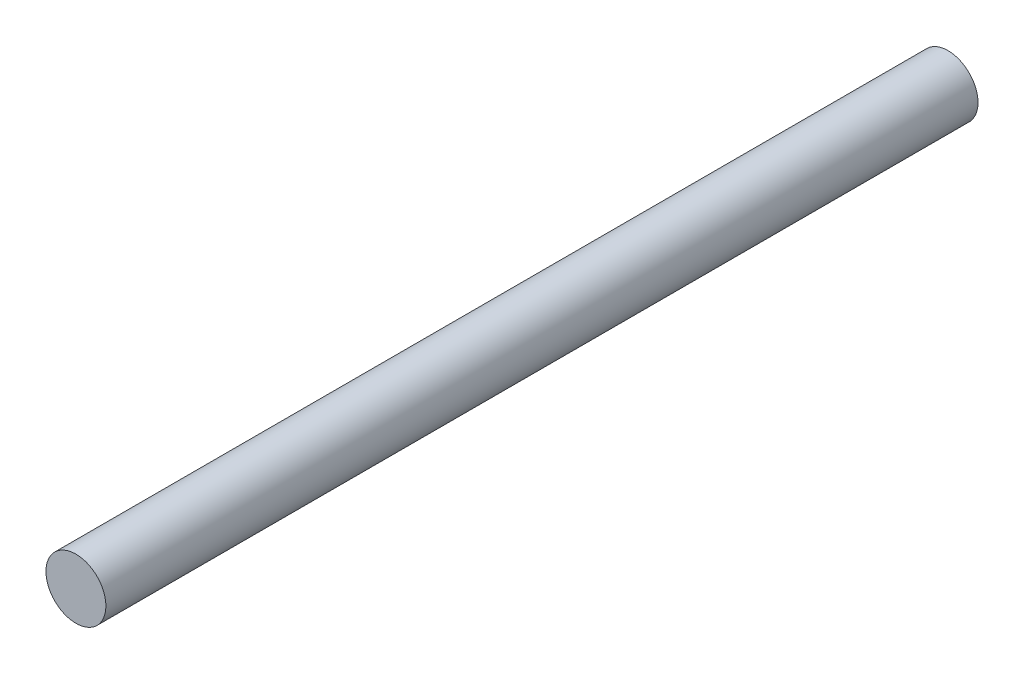
ISO-10303-21;
HEADER;
FILE_DESCRIPTION(('STEP AP214'),'2;1');
FILE_NAME('part.step','',(''),(''),'','','');
FILE_SCHEMA(('AUTOMOTIVE_DESIGN { 1 0 10303 214 1 1 1 1 }'));
ENDSEC;
DATA;
#1=APPLICATION_CONTEXT('core data for automotive mechanical design processes');
#2=APPLICATION_PROTOCOL_DEFINITION('international standard','automotive_design',2000,#1);
#3=PRODUCT_CONTEXT('',#1,'mechanical');
#4=PRODUCT('Part','Part','',(#3));
#5=PRODUCT_RELATED_PRODUCT_CATEGORY('part','',(#4));
#6=PRODUCT_DEFINITION_FORMATION('','',#4);
#7=PRODUCT_DEFINITION_CONTEXT('part definition',#1,'design');
#8=PRODUCT_DEFINITION('design','',#6,#7);
#9=PRODUCT_DEFINITION_SHAPE('','',#8);
#10=(LENGTH_UNIT() NAMED_UNIT(*) SI_UNIT(.MILLI.,.METRE.));
#11=(NAMED_UNIT(*) PLANE_ANGLE_UNIT() SI_UNIT($,.RADIAN.));
#12=(NAMED_UNIT(*) SI_UNIT($,.STERADIAN.) SOLID_ANGLE_UNIT());
#13=UNCERTAINTY_MEASURE_WITH_UNIT(LENGTH_MEASURE(1.E-05),#10,'distance_accuracy_value','');
#14=(GEOMETRIC_REPRESENTATION_CONTEXT(3) GLOBAL_UNCERTAINTY_ASSIGNED_CONTEXT((#13)) GLOBAL_UNIT_ASSIGNED_CONTEXT((#10,
#11,#12)) REPRESENTATION_CONTEXT('',''));
#15=CARTESIAN_POINT('',(0.,0.,0.));
#16=DIRECTION('',(0.,0.,1.));
#17=DIRECTION('',(1.,0.,0.));
#18=AXIS2_PLACEMENT_3D('',#15,#16,#17);
#19=CARTESIAN_POINT('',(0.,0.,160.));
#20=DIRECTION('',(0.,0.,-1.));
#21=DIRECTION('',(-1.,0.,0.));
#22=AXIS2_PLACEMENT_3D('',#19,#20,#21);
#23=CYLINDRICAL_SURFACE('',#22,5.50000000000001);
#24=CARTESIAN_POINT('',(0.,0.,160.));
#25=DIRECTION('',(0.,0.,1.));
#26=DIRECTION('',(1.,0.,0.));
#27=AXIS2_PLACEMENT_3D('',#24,#25,#26);
#28=CIRCLE('',#27,5.50000000000001);
#29=CARTESIAN_POINT('',(5.50000000000001,0.,160.));
#30=VERTEX_POINT('',#29);
#31=EDGE_CURVE('E10',#30,#30,#28,.T.);
#32=ORIENTED_EDGE('',*,*,#31,.F.);
#33=EDGE_LOOP('',(#32));
#34=FACE_BOUND('',#33,.T.);
#35=CARTESIAN_POINT('',(0.,0.,0.));
#36=DIRECTION('',(0.,0.,1.));
#37=DIRECTION('',(1.,0.,0.));
#38=AXIS2_PLACEMENT_3D('',#35,#36,#37);
#39=CIRCLE('',#38,5.50000000000001);
#40=CARTESIAN_POINT('',(5.50000000000001,0.,0.));
#41=VERTEX_POINT('',#40);
#42=EDGE_CURVE('E39',#41,#41,#39,.T.);
#43=ORIENTED_EDGE('',*,*,#42,.T.);
#44=EDGE_LOOP('',(#43));
#45=FACE_BOUND('',#44,.T.);
#46=ADVANCED_FACE('F36',(#34,#45),#23,.T.);
#47=CARTESIAN_POINT('',(0.,0.,160.));
#48=DIRECTION('',(0.,0.,1.));
#49=DIRECTION('',(1.,0.,0.));
#50=AXIS2_PLACEMENT_3D('',#47,#48,#49);
#51=PLANE('',#50);
#52=ORIENTED_EDGE('',*,*,#31,.T.);
#53=EDGE_LOOP('',(#52));
#54=FACE_BOUND('',#53,.T.);
#55=ADVANCED_FACE('F51',(#54),#51,.T.);
#56=CARTESIAN_POINT('',(0.,0.,0.));
#57=DIRECTION('',(0.,0.,1.));
#58=DIRECTION('',(1.,0.,0.));
#59=AXIS2_PLACEMENT_3D('',#56,#57,#58);
#60=PLANE('',#59);
#61=ORIENTED_EDGE('',*,*,#42,.F.);
#62=EDGE_LOOP('',(#61));
#63=FACE_BOUND('',#62,.T.);
#64=ADVANCED_FACE('F49',(#63),#60,.F.);
#65=CLOSED_SHELL('',(#46,#55,#64));
#66=MANIFOLD_SOLID_BREP('B2',#65);
#67=ADVANCED_BREP_SHAPE_REPRESENTATION('',(#18,#66),#14);
#68=SHAPE_DEFINITION_REPRESENTATION(#9,#67);
ENDSEC;
END-ISO-10303-21;
